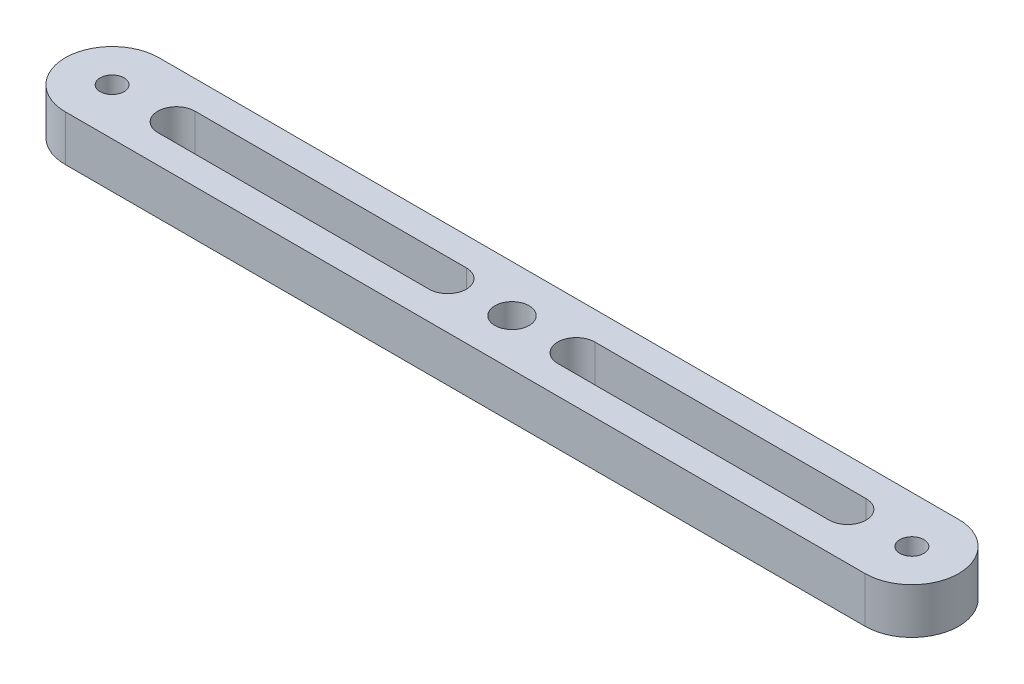
ISO-10303-21;
HEADER;
FILE_DESCRIPTION(('STEP AP214'),'2;1');
FILE_NAME('part.step','',(''),(''),'','','');
FILE_SCHEMA(('AUTOMOTIVE_DESIGN { 1 0 10303 214 1 1 1 1 }'));
ENDSEC;
DATA;
#1=APPLICATION_CONTEXT('core data for automotive mechanical design processes');
#2=APPLICATION_PROTOCOL_DEFINITION('international standard','automotive_design',2000,#1);
#3=PRODUCT_CONTEXT('',#1,'mechanical');
#4=PRODUCT('Part','Part','',(#3));
#5=PRODUCT_RELATED_PRODUCT_CATEGORY('part','',(#4));
#6=PRODUCT_DEFINITION_FORMATION('','',#4);
#7=PRODUCT_DEFINITION_CONTEXT('part definition',#1,'design');
#8=PRODUCT_DEFINITION('design','',#6,#7);
#9=PRODUCT_DEFINITION_SHAPE('','',#8);
#10=(LENGTH_UNIT() NAMED_UNIT(*) SI_UNIT(.MILLI.,.METRE.));
#11=(NAMED_UNIT(*) PLANE_ANGLE_UNIT() SI_UNIT($,.RADIAN.));
#12=(NAMED_UNIT(*) SI_UNIT($,.STERADIAN.) SOLID_ANGLE_UNIT());
#13=UNCERTAINTY_MEASURE_WITH_UNIT(LENGTH_MEASURE(1.E-05),#10,'distance_accuracy_value','');
#14=(GEOMETRIC_REPRESENTATION_CONTEXT(3) GLOBAL_UNCERTAINTY_ASSIGNED_CONTEXT((#13)) GLOBAL_UNIT_ASSIGNED_CONTEXT((#10,
#11,#12)) REPRESENTATION_CONTEXT('',''));
#15=CARTESIAN_POINT('',(0.,0.,0.));
#16=DIRECTION('',(0.,0.,1.));
#17=DIRECTION('',(1.,0.,0.));
#18=AXIS2_PLACEMENT_3D('',#15,#16,#17);
#19=CARTESIAN_POINT('',(35.,-4.,0.));
#20=DIRECTION('',(0.,1.,0.));
#21=DIRECTION('',(0.,0.,1.));
#22=AXIS2_PLACEMENT_3D('',#19,#20,#21);
#23=PLANE('',#22);
#24=CARTESIAN_POINT('',(35.,-4.,0.));
#25=DIRECTION('',(0.,1.,0.));
#26=DIRECTION('',(0.,0.,1.));
#27=AXIS2_PLACEMENT_3D('',#24,#25,#26);
#28=CIRCLE('',#27,4.1);
#29=CARTESIAN_POINT('',(35.,-4.,4.09999999999999));
#30=VERTEX_POINT('',#29);
#31=CARTESIAN_POINT('',(35.,-4.,-4.10000000000001));
#32=VERTEX_POINT('',#31);
#33=EDGE_CURVE('E207',#30,#32,#28,.T.);
#34=ORIENTED_EDGE('',*,*,#33,.F.);
#35=DIRECTION('',(1.,0.,0.));
#36=VECTOR('',#35,1.);
#37=CARTESIAN_POINT('',(35.,-4.,4.09999999999999));
#38=LINE('',#37,#36);
#39=CARTESIAN_POINT('',(-35.,-4.,4.10000000000001));
#40=VERTEX_POINT('',#39);
#41=EDGE_CURVE('E217',#40,#30,#38,.T.);
#42=ORIENTED_EDGE('',*,*,#41,.F.);
#43=CARTESIAN_POINT('',(-35.,-4.,0.));
#44=DIRECTION('',(0.,1.,0.));
#45=DIRECTION('',(0.,0.,1.));
#46=AXIS2_PLACEMENT_3D('',#43,#44,#45);
#47=CIRCLE('',#46,4.1);
#48=CARTESIAN_POINT('',(-35.,-4.,-4.09999999999999));
#49=VERTEX_POINT('',#48);
#50=EDGE_CURVE('E214',#49,#40,#47,.T.);
#51=ORIENTED_EDGE('',*,*,#50,.F.);
#52=DIRECTION('',(-1.,0.,0.));
#53=VECTOR('',#52,1.);
#54=CARTESIAN_POINT('',(35.,-4.,-4.10000000000001));
#55=LINE('',#54,#53);
#56=EDGE_CURVE('E210',#32,#49,#55,.T.);
#57=ORIENTED_EDGE('',*,*,#56,.F.);
#58=EDGE_LOOP('',(#34,#42,#51,#57));
#59=FACE_BOUND('',#58,.T.);
#60=CARTESIAN_POINT('',(0.,-4.,0.));
#61=DIRECTION('',(0.,1.,0.));
#62=DIRECTION('',(0.,0.,1.));
#63=AXIS2_PLACEMENT_3D('',#60,#61,#62);
#64=CIRCLE('',#63,1.5);
#65=CARTESIAN_POINT('',(0.,-4.,1.5));
#66=VERTEX_POINT('',#65);
#67=EDGE_CURVE('E203',#66,#66,#64,.F.);
#68=ORIENTED_EDGE('',*,*,#67,.F.);
#69=EDGE_LOOP('',(#68));
#70=FACE_BOUND('',#69,.T.);
#71=CARTESIAN_POINT('',(-35.,-4.,0.));
#72=DIRECTION('',(0.,1.,0.));
#73=DIRECTION('',(0.,0.,1.));
#74=AXIS2_PLACEMENT_3D('',#71,#72,#73);
#75=CIRCLE('',#74,1.04999999999999);
#76=CARTESIAN_POINT('',(-35.,-4.,1.05));
#77=VERTEX_POINT('',#76);
#78=EDGE_CURVE('E197',#77,#77,#75,.F.);
#79=ORIENTED_EDGE('',*,*,#78,.F.);
#80=EDGE_LOOP('',(#79));
#81=FACE_BOUND('',#80,.T.);
#82=DIRECTION('',(-1.,0.,0.));
#83=VECTOR('',#82,1.);
#84=CARTESIAN_POINT('',(-29.375,-4.,-1.625));
#85=LINE('',#84,#83);
#86=CARTESIAN_POINT('',(-5.625,-4.,-1.625));
#87=VERTEX_POINT('',#86);
#88=CARTESIAN_POINT('',(-29.375,-4.,-1.625));
#89=VERTEX_POINT('',#88);
#90=EDGE_CURVE('E173',#87,#89,#85,.T.);
#91=ORIENTED_EDGE('',*,*,#90,.T.);
#92=CARTESIAN_POINT('',(-29.375,-4.,0.));
#93=DIRECTION('',(0.,1.,0.));
#94=DIRECTION('',(0.,0.,1.));
#95=AXIS2_PLACEMENT_3D('',#92,#93,#94);
#96=CIRCLE('',#95,1.625);
#97=CARTESIAN_POINT('',(-29.375,-4.,1.625));
#98=VERTEX_POINT('',#97);
#99=EDGE_CURVE('E163',#89,#98,#96,.T.);
#100=ORIENTED_EDGE('',*,*,#99,.T.);
#101=DIRECTION('',(1.,0.,0.));
#102=VECTOR('',#101,1.);
#103=CARTESIAN_POINT('',(-29.375,-4.,1.625));
#104=LINE('',#103,#102);
#105=CARTESIAN_POINT('',(-5.62500000000001,-4.,1.625));
#106=VERTEX_POINT('',#105);
#107=EDGE_CURVE('E166',#98,#106,#104,.T.);
#108=ORIENTED_EDGE('',*,*,#107,.T.);
#109=CARTESIAN_POINT('',(-5.625,-4.,0.));
#110=DIRECTION('',(0.,1.,0.));
#111=DIRECTION('',(0.,0.,1.));
#112=AXIS2_PLACEMENT_3D('',#109,#110,#111);
#113=CIRCLE('',#112,1.625);
#114=EDGE_CURVE('E170',#106,#87,#113,.T.);
#115=ORIENTED_EDGE('',*,*,#114,.T.);
#116=EDGE_LOOP('',(#91,#100,#108,#115));
#117=FACE_BOUND('',#116,.T.);
#118=CARTESIAN_POINT('',(35.,-4.,0.));
#119=DIRECTION('',(0.,1.,0.));
#120=DIRECTION('',(0.,0.,1.));
#121=AXIS2_PLACEMENT_3D('',#118,#119,#120);
#122=CIRCLE('',#121,1.04999999999999);
#123=CARTESIAN_POINT('',(35.,-4.,1.05));
#124=VERTEX_POINT('',#123);
#125=EDGE_CURVE('E159',#124,#124,#122,.T.);
#126=ORIENTED_EDGE('',*,*,#125,.T.);
#127=EDGE_LOOP('',(#126));
#128=FACE_BOUND('',#127,.T.);
#129=CARTESIAN_POINT('',(29.375,-4.,0.));
#130=DIRECTION('',(0.,-1.,0.));
#131=DIRECTION('',(0.,0.,1.));
#132=AXIS2_PLACEMENT_3D('',#129,#130,#131);
#133=CIRCLE('',#132,1.625);
#134=CARTESIAN_POINT('',(29.375,-4.,-1.625));
#135=VERTEX_POINT('',#134);
#136=CARTESIAN_POINT('',(29.375,-4.,1.625));
#137=VERTEX_POINT('',#136);
#138=EDGE_CURVE('E131',#135,#137,#133,.T.);
#139=ORIENTED_EDGE('',*,*,#138,.F.);
#140=DIRECTION('',(1.,0.,0.));
#141=VECTOR('',#140,1.);
#142=CARTESIAN_POINT('',(29.375,-4.,-1.625));
#143=LINE('',#142,#141);
#144=CARTESIAN_POINT('',(5.625,-4.,-1.625));
#145=VERTEX_POINT('',#144);
#146=EDGE_CURVE('E123',#145,#135,#143,.T.);
#147=ORIENTED_EDGE('',*,*,#146,.F.);
#148=CARTESIAN_POINT('',(5.625,-4.,0.));
#149=DIRECTION('',(0.,-1.,0.));
#150=DIRECTION('',(0.,0.,1.));
#151=AXIS2_PLACEMENT_3D('',#148,#149,#150);
#152=CIRCLE('',#151,1.625);
#153=CARTESIAN_POINT('',(5.625,-4.,1.625));
#154=VERTEX_POINT('',#153);
#155=EDGE_CURVE('E130',#154,#145,#152,.T.);
#156=ORIENTED_EDGE('',*,*,#155,.F.);
#157=DIRECTION('',(-1.,0.,0.));
#158=VECTOR('',#157,1.);
#159=CARTESIAN_POINT('',(29.375,-4.,1.625));
#160=LINE('',#159,#158);
#161=EDGE_CURVE('E135',#137,#154,#160,.T.);
#162=ORIENTED_EDGE('',*,*,#161,.F.);
#163=EDGE_LOOP('',(#139,#147,#156,#162));
#164=FACE_BOUND('',#163,.T.);
#165=ADVANCED_FACE('F33',(#59,#70,#81,#117,#128,#164),#23,.F.);
#166=CARTESIAN_POINT('',(35.,0.,0.));
#167=DIRECTION('',(0.,1.,0.));
#168=DIRECTION('',(0.,0.,1.));
#169=AXIS2_PLACEMENT_3D('',#166,#167,#168);
#170=PLANE('',#169);
#171=CARTESIAN_POINT('',(35.,0.,0.));
#172=DIRECTION('',(0.,-1.,0.));
#173=DIRECTION('',(0.,0.,1.));
#174=AXIS2_PLACEMENT_3D('',#171,#172,#173);
#175=CIRCLE('',#174,1.04999999999999);
#176=CARTESIAN_POINT('',(35.,0.,1.05));
#177=VERTEX_POINT('',#176);
#178=EDGE_CURVE('E153',#177,#177,#175,.T.);
#179=ORIENTED_EDGE('',*,*,#178,.T.);
#180=EDGE_LOOP('',(#179));
#181=FACE_BOUND('',#180,.T.);
#182=CARTESIAN_POINT('',(-29.375,0.,0.));
#183=DIRECTION('',(0.,1.,0.));
#184=DIRECTION('',(0.,0.,1.));
#185=AXIS2_PLACEMENT_3D('',#182,#183,#184);
#186=CIRCLE('',#185,1.625);
#187=CARTESIAN_POINT('',(-29.375,0.,-1.625));
#188=VERTEX_POINT('',#187);
#189=CARTESIAN_POINT('',(-29.375,0.,1.625));
#190=VERTEX_POINT('',#189);
#191=EDGE_CURVE('E162',#188,#190,#186,.T.);
#192=ORIENTED_EDGE('',*,*,#191,.F.);
#193=DIRECTION('',(-1.,0.,0.));
#194=VECTOR('',#193,1.);
#195=CARTESIAN_POINT('',(-29.375,0.,-1.625));
#196=LINE('',#195,#194);
#197=CARTESIAN_POINT('',(-5.625,0.,-1.625));
#198=VERTEX_POINT('',#197);
#199=EDGE_CURVE('E167',#198,#188,#196,.T.);
#200=ORIENTED_EDGE('',*,*,#199,.F.);
#201=CARTESIAN_POINT('',(-5.625,0.,0.));
#202=DIRECTION('',(0.,1.,0.));
#203=DIRECTION('',(0.,0.,1.));
#204=AXIS2_PLACEMENT_3D('',#201,#202,#203);
#205=CIRCLE('',#204,1.625);
#206=CARTESIAN_POINT('',(-5.625,0.,1.625));
#207=VERTEX_POINT('',#206);
#208=EDGE_CURVE('E181',#207,#198,#205,.T.);
#209=ORIENTED_EDGE('',*,*,#208,.F.);
#210=DIRECTION('',(1.,0.,0.));
#211=VECTOR('',#210,1.);
#212=CARTESIAN_POINT('',(-29.375,0.,1.625));
#213=LINE('',#212,#211);
#214=EDGE_CURVE('E178',#190,#207,#213,.T.);
#215=ORIENTED_EDGE('',*,*,#214,.F.);
#216=EDGE_LOOP('',(#192,#200,#209,#215));
#217=FACE_BOUND('',#216,.T.);
#218=CARTESIAN_POINT('',(-35.,0.,0.));
#219=DIRECTION('',(0.,1.,0.));
#220=DIRECTION('',(0.,0.,1.));
#221=AXIS2_PLACEMENT_3D('',#218,#219,#220);
#222=CIRCLE('',#221,1.04999999999999);
#223=CARTESIAN_POINT('',(-35.,0.,1.05));
#224=VERTEX_POINT('',#223);
#225=EDGE_CURVE('E188',#224,#224,#222,.T.);
#226=ORIENTED_EDGE('',*,*,#225,.F.);
#227=EDGE_LOOP('',(#226));
#228=FACE_BOUND('',#227,.T.);
#229=CARTESIAN_POINT('',(0.,0.,0.));
#230=DIRECTION('',(0.,1.,0.));
#231=DIRECTION('',(0.,0.,1.));
#232=AXIS2_PLACEMENT_3D('',#229,#230,#231);
#233=CIRCLE('',#232,1.5);
#234=CARTESIAN_POINT('',(0.,0.,1.5));
#235=VERTEX_POINT('',#234);
#236=EDGE_CURVE('E200',#235,#235,#233,.T.);
#237=ORIENTED_EDGE('',*,*,#236,.F.);
#238=EDGE_LOOP('',(#237));
#239=FACE_BOUND('',#238,.T.);
#240=CARTESIAN_POINT('',(35.,0.,0.));
#241=DIRECTION('',(0.,1.,0.));
#242=DIRECTION('',(0.,0.,1.));
#243=AXIS2_PLACEMENT_3D('',#240,#241,#242);
#244=CIRCLE('',#243,4.1);
#245=CARTESIAN_POINT('',(35.,0.,4.09999999999999));
#246=VERTEX_POINT('',#245);
#247=CARTESIAN_POINT('',(35.,0.,-4.10000000000001));
#248=VERTEX_POINT('',#247);
#249=EDGE_CURVE('E206',#246,#248,#244,.T.);
#250=ORIENTED_EDGE('',*,*,#249,.T.);
#251=DIRECTION('',(-1.,0.,0.));
#252=VECTOR('',#251,1.);
#253=CARTESIAN_POINT('',(35.,0.,-4.10000000000001));
#254=LINE('',#253,#252);
#255=CARTESIAN_POINT('',(-35.,0.,-4.09999999999999));
#256=VERTEX_POINT('',#255);
#257=EDGE_CURVE('E222',#248,#256,#254,.T.);
#258=ORIENTED_EDGE('',*,*,#257,.T.);
#259=CARTESIAN_POINT('',(-35.,0.,0.));
#260=DIRECTION('',(0.,1.,0.));
#261=DIRECTION('',(0.,0.,1.));
#262=AXIS2_PLACEMENT_3D('',#259,#260,#261);
#263=CIRCLE('',#262,4.1);
#264=CARTESIAN_POINT('',(-35.,0.,4.10000000000001));
#265=VERTEX_POINT('',#264);
#266=EDGE_CURVE('E225',#256,#265,#263,.T.);
#267=ORIENTED_EDGE('',*,*,#266,.T.);
#268=DIRECTION('',(1.,0.,0.));
#269=VECTOR('',#268,1.);
#270=CARTESIAN_POINT('',(35.,0.,4.09999999999999));
#271=LINE('',#270,#269);
#272=EDGE_CURVE('E211',#265,#246,#271,.T.);
#273=ORIENTED_EDGE('',*,*,#272,.T.);
#274=EDGE_LOOP('',(#250,#258,#267,#273));
#275=FACE_BOUND('',#274,.T.);
#276=DIRECTION('',(1.,0.,0.));
#277=VECTOR('',#276,1.);
#278=CARTESIAN_POINT('',(29.375,0.,-1.625));
#279=LINE('',#278,#277);
#280=CARTESIAN_POINT('',(5.625,0.,-1.625));
#281=VERTEX_POINT('',#280);
#282=CARTESIAN_POINT('',(29.375,0.,-1.625));
#283=VERTEX_POINT('',#282);
#284=EDGE_CURVE('E147',#281,#283,#279,.T.);
#285=ORIENTED_EDGE('',*,*,#284,.T.);
#286=CARTESIAN_POINT('',(29.375,0.,0.));
#287=DIRECTION('',(0.,-1.,0.));
#288=DIRECTION('',(0.,0.,1.));
#289=AXIS2_PLACEMENT_3D('',#286,#287,#288);
#290=CIRCLE('',#289,1.625);
#291=CARTESIAN_POINT('',(29.375,0.,1.625));
#292=VERTEX_POINT('',#291);
#293=EDGE_CURVE('E58',#283,#292,#290,.T.);
#294=ORIENTED_EDGE('',*,*,#293,.T.);
#295=DIRECTION('',(-1.,0.,0.));
#296=VECTOR('',#295,1.);
#297=CARTESIAN_POINT('',(29.375,0.,1.625));
#298=LINE('',#297,#296);
#299=CARTESIAN_POINT('',(5.625,0.,1.625));
#300=VERTEX_POINT('',#299);
#301=EDGE_CURVE('E138',#292,#300,#298,.T.);
#302=ORIENTED_EDGE('',*,*,#301,.T.);
#303=CARTESIAN_POINT('',(5.625,0.,0.));
#304=DIRECTION('',(0.,-1.,0.));
#305=DIRECTION('',(0.,0.,1.));
#306=AXIS2_PLACEMENT_3D('',#303,#304,#305);
#307=CIRCLE('',#306,1.625);
#308=EDGE_CURVE('E141',#300,#281,#307,.T.);
#309=ORIENTED_EDGE('',*,*,#308,.T.);
#310=EDGE_LOOP('',(#285,#294,#302,#309));
#311=FACE_BOUND('',#310,.T.);
#312=ADVANCED_FACE('F240',(#181,#217,#228,#239,#275,#311),#170,.T.);
#313=CARTESIAN_POINT('',(35.,-4.,0.));
#314=DIRECTION('',(0.,1.,0.));
#315=DIRECTION('',(0.,0.,1.));
#316=AXIS2_PLACEMENT_3D('',#313,#314,#315);
#317=CYLINDRICAL_SURFACE('',#316,4.1);
#318=ORIENTED_EDGE('',*,*,#249,.F.);
#319=DIRECTION('',(0.,1.,0.));
#320=VECTOR('',#319,1.);
#321=CARTESIAN_POINT('',(35.,-4.,4.09999999999999));
#322=LINE('',#321,#320);
#323=EDGE_CURVE('E11',#30,#246,#322,.T.);
#324=ORIENTED_EDGE('',*,*,#323,.F.);
#325=ORIENTED_EDGE('',*,*,#33,.T.);
#326=DIRECTION('',(0.,1.,0.));
#327=VECTOR('',#326,1.);
#328=CARTESIAN_POINT('',(35.,-4.,-4.10000000000001));
#329=LINE('',#328,#327);
#330=EDGE_CURVE('E37',#32,#248,#329,.T.);
#331=ORIENTED_EDGE('',*,*,#330,.T.);
#332=EDGE_LOOP('',(#318,#324,#325,#331));
#333=FACE_BOUND('',#332,.T.);
#334=ADVANCED_FACE('F35',(#333),#317,.T.);
#335=CARTESIAN_POINT('',(35.,-4.,4.09999999999999));
#336=DIRECTION('',(0.,0.,1.));
#337=DIRECTION('',(1.,0.,0.));
#338=AXIS2_PLACEMENT_3D('',#335,#336,#337);
#339=PLANE('',#338);
#340=ORIENTED_EDGE('',*,*,#272,.F.);
#341=DIRECTION('',(0.,1.,0.));
#342=VECTOR('',#341,1.);
#343=CARTESIAN_POINT('',(-35.,-4.,4.10000000000001));
#344=LINE('',#343,#342);
#345=EDGE_CURVE('E42',#40,#265,#344,.T.);
#346=ORIENTED_EDGE('',*,*,#345,.F.);
#347=ORIENTED_EDGE('',*,*,#41,.T.);
#348=ORIENTED_EDGE('',*,*,#323,.T.);
#349=EDGE_LOOP('',(#340,#346,#347,#348));
#350=FACE_BOUND('',#349,.T.);
#351=ADVANCED_FACE('F244',(#350),#339,.T.);
#352=CARTESIAN_POINT('',(-35.,-4.,0.));
#353=DIRECTION('',(0.,1.,0.));
#354=DIRECTION('',(0.,0.,1.));
#355=AXIS2_PLACEMENT_3D('',#352,#353,#354);
#356=CYLINDRICAL_SURFACE('',#355,4.1);
#357=ORIENTED_EDGE('',*,*,#266,.F.);
#358=DIRECTION('',(0.,1.,0.));
#359=VECTOR('',#358,1.);
#360=CARTESIAN_POINT('',(-35.,-4.,-4.09999999999999));
#361=LINE('',#360,#359);
#362=EDGE_CURVE('E230',#49,#256,#361,.T.);
#363=ORIENTED_EDGE('',*,*,#362,.F.);
#364=ORIENTED_EDGE('',*,*,#50,.T.);
#365=ORIENTED_EDGE('',*,*,#345,.T.);
#366=EDGE_LOOP('',(#357,#363,#364,#365));
#367=FACE_BOUND('',#366,.T.);
#368=ADVANCED_FACE('F250',(#367),#356,.T.);
#369=CARTESIAN_POINT('',(35.,-4.,-4.10000000000001));
#370=DIRECTION('',(0.,0.,-1.));
#371=DIRECTION('',(-1.,0.,0.));
#372=AXIS2_PLACEMENT_3D('',#369,#370,#371);
#373=PLANE('',#372);
#374=ORIENTED_EDGE('',*,*,#257,.F.);
#375=ORIENTED_EDGE('',*,*,#330,.F.);
#376=ORIENTED_EDGE('',*,*,#56,.T.);
#377=ORIENTED_EDGE('',*,*,#362,.T.);
#378=EDGE_LOOP('',(#374,#375,#376,#377));
#379=FACE_BOUND('',#378,.T.);
#380=ADVANCED_FACE('F238',(#379),#373,.T.);
#381=CARTESIAN_POINT('',(0.,-8.24264068711929,0.));
#382=DIRECTION('',(0.,1.,0.));
#383=DIRECTION('',(0.,0.,1.));
#384=AXIS2_PLACEMENT_3D('',#381,#382,#383);
#385=CYLINDRICAL_SURFACE('',#384,1.5);
#386=ORIENTED_EDGE('',*,*,#67,.T.);
#387=EDGE_LOOP('',(#386));
#388=FACE_BOUND('',#387,.T.);
#389=ORIENTED_EDGE('',*,*,#236,.T.);
#390=EDGE_LOOP('',(#389));
#391=FACE_BOUND('',#390,.T.);
#392=ADVANCED_FACE('F257',(#388,#391),#385,.F.);
#393=CARTESIAN_POINT('',(-35.,-6.96984848098349,0.));
#394=DIRECTION('',(0.,1.,0.));
#395=DIRECTION('',(0.,0.,1.));
#396=AXIS2_PLACEMENT_3D('',#393,#394,#395);
#397=CYLINDRICAL_SURFACE('',#396,1.04999999999999);
#398=ORIENTED_EDGE('',*,*,#78,.T.);
#399=EDGE_LOOP('',(#398));
#400=FACE_BOUND('',#399,.T.);
#401=ORIENTED_EDGE('',*,*,#225,.T.);
#402=EDGE_LOOP('',(#401));
#403=FACE_BOUND('',#402,.T.);
#404=ADVANCED_FACE('F269',(#400,#403),#397,.F.);
#405=CARTESIAN_POINT('',(-29.375,-4.,0.));
#406=DIRECTION('',(0.,1.,0.));
#407=DIRECTION('',(0.,0.,1.));
#408=AXIS2_PLACEMENT_3D('',#405,#406,#407);
#409=CYLINDRICAL_SURFACE('',#408,1.625);
#410=ORIENTED_EDGE('',*,*,#191,.T.);
#411=DIRECTION('',(0.,1.,0.));
#412=VECTOR('',#411,1.);
#413=CARTESIAN_POINT('',(-29.375,-4.,1.625));
#414=LINE('',#413,#412);
#415=EDGE_CURVE('E176',#98,#190,#414,.T.);
#416=ORIENTED_EDGE('',*,*,#415,.F.);
#417=ORIENTED_EDGE('',*,*,#99,.F.);
#418=DIRECTION('',(0.,1.,0.));
#419=VECTOR('',#418,1.);
#420=CARTESIAN_POINT('',(-29.375,-4.,-1.625));
#421=LINE('',#420,#419);
#422=EDGE_CURVE('E186',#89,#188,#421,.T.);
#423=ORIENTED_EDGE('',*,*,#422,.T.);
#424=EDGE_LOOP('',(#410,#416,#417,#423));
#425=FACE_BOUND('',#424,.T.);
#426=ADVANCED_FACE('F273',(#425),#409,.F.);
#427=CARTESIAN_POINT('',(-29.375,-4.,-1.625));
#428=DIRECTION('',(0.,0.,-1.));
#429=DIRECTION('',(-1.,0.,0.));
#430=AXIS2_PLACEMENT_3D('',#427,#428,#429);
#431=PLANE('',#430);
#432=ORIENTED_EDGE('',*,*,#199,.T.);
#433=ORIENTED_EDGE('',*,*,#422,.F.);
#434=ORIENTED_EDGE('',*,*,#90,.F.);
#435=DIRECTION('',(0.,1.,0.));
#436=VECTOR('',#435,1.);
#437=CARTESIAN_POINT('',(-5.625,-4.,-1.625));
#438=LINE('',#437,#436);
#439=EDGE_CURVE('E189',#87,#198,#438,.T.);
#440=ORIENTED_EDGE('',*,*,#439,.T.);
#441=EDGE_LOOP('',(#432,#433,#434,#440));
#442=FACE_BOUND('',#441,.T.);
#443=ADVANCED_FACE('F277',(#442),#431,.F.);
#444=CARTESIAN_POINT('',(-5.625,-4.,0.));
#445=DIRECTION('',(0.,1.,0.));
#446=DIRECTION('',(0.,0.,1.));
#447=AXIS2_PLACEMENT_3D('',#444,#445,#446);
#448=CYLINDRICAL_SURFACE('',#447,1.625);
#449=ORIENTED_EDGE('',*,*,#208,.T.);
#450=ORIENTED_EDGE('',*,*,#439,.F.);
#451=ORIENTED_EDGE('',*,*,#114,.F.);
#452=DIRECTION('',(0.,1.,0.));
#453=VECTOR('',#452,1.);
#454=CARTESIAN_POINT('',(-5.625,-4.,1.625));
#455=LINE('',#454,#453);
#456=EDGE_CURVE('E191',#106,#207,#455,.T.);
#457=ORIENTED_EDGE('',*,*,#456,.T.);
#458=EDGE_LOOP('',(#449,#450,#451,#457));
#459=FACE_BOUND('',#458,.T.);
#460=ADVANCED_FACE('F283',(#459),#448,.F.);
#461=CARTESIAN_POINT('',(-29.375,-4.,1.625));
#462=DIRECTION('',(0.,0.,1.));
#463=DIRECTION('',(1.,0.,0.));
#464=AXIS2_PLACEMENT_3D('',#461,#462,#463);
#465=PLANE('',#464);
#466=ORIENTED_EDGE('',*,*,#214,.T.);
#467=ORIENTED_EDGE('',*,*,#456,.F.);
#468=ORIENTED_EDGE('',*,*,#107,.F.);
#469=ORIENTED_EDGE('',*,*,#415,.T.);
#470=EDGE_LOOP('',(#466,#467,#468,#469));
#471=FACE_BOUND('',#470,.T.);
#472=ADVANCED_FACE('F279',(#471),#465,.F.);
#473=CARTESIAN_POINT('',(35.,-6.96984848098349,0.));
#474=DIRECTION('',(0.,1.,0.));
#475=DIRECTION('',(0.,0.,1.));
#476=AXIS2_PLACEMENT_3D('',#473,#474,#475);
#477=CYLINDRICAL_SURFACE('',#476,1.04999999999999);
#478=ORIENTED_EDGE('',*,*,#125,.F.);
#479=EDGE_LOOP('',(#478));
#480=FACE_BOUND('',#479,.T.);
#481=ORIENTED_EDGE('',*,*,#178,.F.);
#482=EDGE_LOOP('',(#481));
#483=FACE_BOUND('',#482,.T.);
#484=ADVANCED_FACE('F282',(#480,#483),#477,.F.);
#485=CARTESIAN_POINT('',(29.375,-4.,0.));
#486=DIRECTION('',(0.,1.,0.));
#487=DIRECTION('',(0.,0.,1.));
#488=AXIS2_PLACEMENT_3D('',#485,#486,#487);
#489=CYLINDRICAL_SURFACE('',#488,1.625);
#490=ORIENTED_EDGE('',*,*,#293,.F.);
#491=DIRECTION('',(0.,1.,0.));
#492=VECTOR('',#491,1.);
#493=CARTESIAN_POINT('',(29.375,-4.,-1.625));
#494=LINE('',#493,#492);
#495=EDGE_CURVE('E125',#135,#283,#494,.T.);
#496=ORIENTED_EDGE('',*,*,#495,.F.);
#497=ORIENTED_EDGE('',*,*,#138,.T.);
#498=DIRECTION('',(0.,1.,0.));
#499=VECTOR('',#498,1.);
#500=CARTESIAN_POINT('',(29.375,-4.,1.625));
#501=LINE('',#500,#499);
#502=EDGE_CURVE('E151',#137,#292,#501,.T.);
#503=ORIENTED_EDGE('',*,*,#502,.T.);
#504=EDGE_LOOP('',(#490,#496,#497,#503));
#505=FACE_BOUND('',#504,.T.);
#506=ADVANCED_FACE('F133',(#505),#489,.F.);
#507=CARTESIAN_POINT('',(29.375,-4.,1.625));
#508=DIRECTION('',(0.,0.,-1.));
#509=DIRECTION('',(-1.,0.,0.));
#510=AXIS2_PLACEMENT_3D('',#507,#508,#509);
#511=PLANE('',#510);
#512=ORIENTED_EDGE('',*,*,#301,.F.);
#513=ORIENTED_EDGE('',*,*,#502,.F.);
#514=ORIENTED_EDGE('',*,*,#161,.T.);
#515=DIRECTION('',(0.,1.,0.));
#516=VECTOR('',#515,1.);
#517=CARTESIAN_POINT('',(5.625,-4.,1.625));
#518=LINE('',#517,#516);
#519=EDGE_CURVE('E154',#154,#300,#518,.T.);
#520=ORIENTED_EDGE('',*,*,#519,.T.);
#521=EDGE_LOOP('',(#512,#513,#514,#520));
#522=FACE_BOUND('',#521,.T.);
#523=ADVANCED_FACE('F296',(#522),#511,.T.);
#524=CARTESIAN_POINT('',(5.625,-4.,0.));
#525=DIRECTION('',(0.,1.,0.));
#526=DIRECTION('',(0.,0.,1.));
#527=AXIS2_PLACEMENT_3D('',#524,#525,#526);
#528=CYLINDRICAL_SURFACE('',#527,1.625);
#529=ORIENTED_EDGE('',*,*,#308,.F.);
#530=ORIENTED_EDGE('',*,*,#519,.F.);
#531=ORIENTED_EDGE('',*,*,#155,.T.);
#532=DIRECTION('',(0.,1.,0.));
#533=VECTOR('',#532,1.);
#534=CARTESIAN_POINT('',(5.625,-4.,-1.625));
#535=LINE('',#534,#533);
#536=EDGE_CURVE('E50',#145,#281,#535,.T.);
#537=ORIENTED_EDGE('',*,*,#536,.T.);
#538=EDGE_LOOP('',(#529,#530,#531,#537));
#539=FACE_BOUND('',#538,.T.);
#540=ADVANCED_FACE('F299',(#539),#528,.F.);
#541=CARTESIAN_POINT('',(29.375,-4.,-1.625));
#542=DIRECTION('',(0.,0.,1.));
#543=DIRECTION('',(1.,0.,0.));
#544=AXIS2_PLACEMENT_3D('',#541,#542,#543);
#545=PLANE('',#544);
#546=ORIENTED_EDGE('',*,*,#284,.F.);
#547=ORIENTED_EDGE('',*,*,#536,.F.);
#548=ORIENTED_EDGE('',*,*,#146,.T.);
#549=ORIENTED_EDGE('',*,*,#495,.T.);
#550=EDGE_LOOP('',(#546,#547,#548,#549));
#551=FACE_BOUND('',#550,.T.);
#552=ADVANCED_FACE('F124',(#551),#545,.T.);
#553=CLOSED_SHELL('',(#165,#312,#334,#351,#368,#380,#392,#404,#426,#443,#460,#472,#484,#506,
#523,#540,#552));
#554=MANIFOLD_SOLID_BREP('B2',#553);
#555=ADVANCED_BREP_SHAPE_REPRESENTATION('',(#18,#554),#14);
#556=SHAPE_DEFINITION_REPRESENTATION(#9,#555);
ENDSEC;
END-ISO-10303-21;
